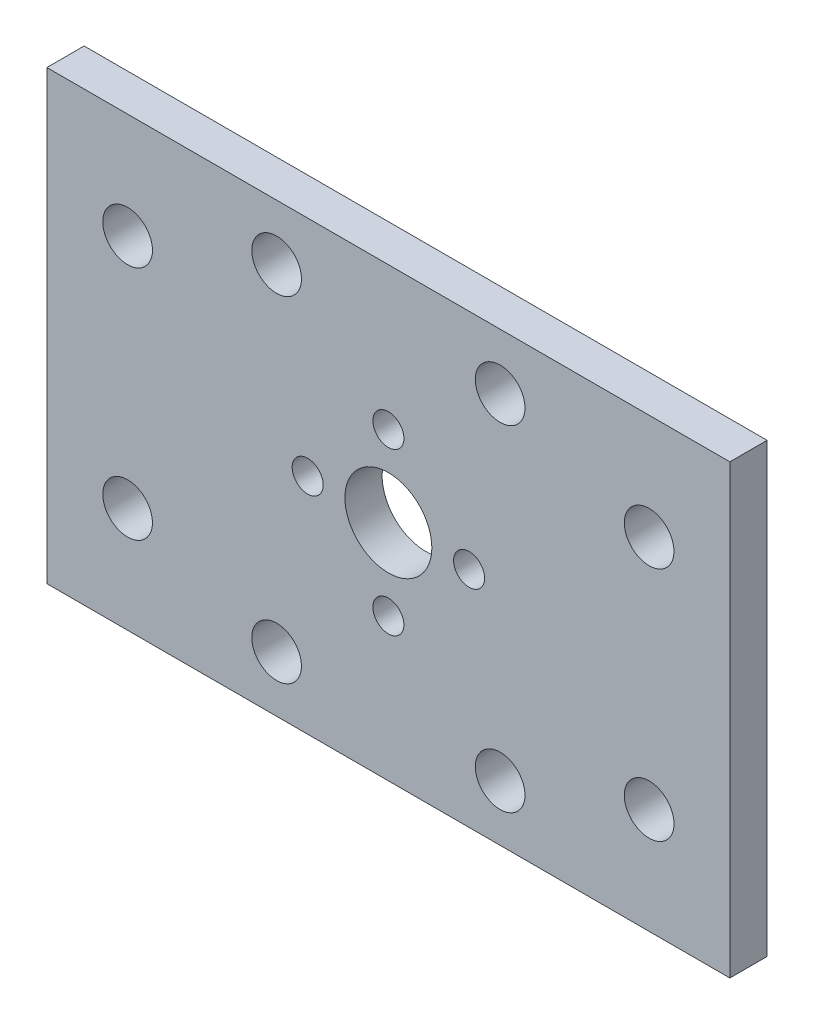
ISO-10303-21;
HEADER;
FILE_DESCRIPTION(('STEP AP214'),'2;1');
FILE_NAME('part.step','',(''),(''),'','','');
FILE_SCHEMA(('AUTOMOTIVE_DESIGN { 1 0 10303 214 1 1 1 1 }'));
ENDSEC;
DATA;
#1=APPLICATION_CONTEXT('core data for automotive mechanical design processes');
#2=APPLICATION_PROTOCOL_DEFINITION('international standard','automotive_design',2000,#1);
#3=PRODUCT_CONTEXT('',#1,'mechanical');
#4=PRODUCT('Part','Part','',(#3));
#5=PRODUCT_RELATED_PRODUCT_CATEGORY('part','',(#4));
#6=PRODUCT_DEFINITION_FORMATION('','',#4);
#7=PRODUCT_DEFINITION_CONTEXT('part definition',#1,'design');
#8=PRODUCT_DEFINITION('design','',#6,#7);
#9=PRODUCT_DEFINITION_SHAPE('','',#8);
#10=(LENGTH_UNIT() NAMED_UNIT(*) SI_UNIT(.MILLI.,.METRE.));
#11=(NAMED_UNIT(*) PLANE_ANGLE_UNIT() SI_UNIT($,.RADIAN.));
#12=(NAMED_UNIT(*) SI_UNIT($,.STERADIAN.) SOLID_ANGLE_UNIT());
#13=UNCERTAINTY_MEASURE_WITH_UNIT(LENGTH_MEASURE(1.E-05),#10,'distance_accuracy_value','');
#14=(GEOMETRIC_REPRESENTATION_CONTEXT(3) GLOBAL_UNCERTAINTY_ASSIGNED_CONTEXT((#13)) GLOBAL_UNIT_ASSIGNED_CONTEXT((#10,
#11,#12)) REPRESENTATION_CONTEXT('',''));
#15=CARTESIAN_POINT('',(0.,0.,0.));
#16=DIRECTION('',(0.,0.,1.));
#17=DIRECTION('',(1.,0.,0.));
#18=AXIS2_PLACEMENT_3D('',#15,#16,#17);
#19=CARTESIAN_POINT('',(0.,0.,1.5));
#20=DIRECTION('',(0.,0.,1.));
#21=DIRECTION('',(1.,0.,0.));
#22=AXIS2_PLACEMENT_3D('',#19,#20,#21);
#23=PLANE('',#22);
#24=CARTESIAN_POINT('',(9.,13.5,1.5));
#25=DIRECTION('',(0.,0.,1.));
#26=DIRECTION('',(-1.,0.,0.));
#27=AXIS2_PLACEMENT_3D('',#24,#25,#26);
#28=CIRCLE('',#27,2.);
#29=CARTESIAN_POINT('',(7.,13.5,1.5));
#30=VERTEX_POINT('',#29);
#31=EDGE_CURVE('E175',#30,#30,#28,.T.);
#32=ORIENTED_EDGE('',*,*,#31,.F.);
#33=EDGE_LOOP('',(#32));
#34=FACE_BOUND('',#33,.T.);
#35=CARTESIAN_POINT('',(9.,-13.5,1.5));
#36=DIRECTION('',(0.,0.,1.));
#37=DIRECTION('',(1.,0.,0.));
#38=AXIS2_PLACEMENT_3D('',#35,#36,#37);
#39=CIRCLE('',#38,2.);
#40=CARTESIAN_POINT('',(11.,-13.5,1.5));
#41=VERTEX_POINT('',#40);
#42=EDGE_CURVE('E163',#41,#41,#39,.T.);
#43=ORIENTED_EDGE('',*,*,#42,.F.);
#44=EDGE_LOOP('',(#43));
#45=FACE_BOUND('',#44,.T.);
#46=CARTESIAN_POINT('',(0.,-6.5,1.5));
#47=DIRECTION('',(0.,0.,1.));
#48=DIRECTION('',(1.,0.,0.));
#49=AXIS2_PLACEMENT_3D('',#46,#47,#48);
#50=CIRCLE('',#49,1.25);
#51=CARTESIAN_POINT('',(1.25,-6.5,1.5));
#52=VERTEX_POINT('',#51);
#53=EDGE_CURVE('E151',#52,#52,#50,.T.);
#54=ORIENTED_EDGE('',*,*,#53,.F.);
#55=EDGE_LOOP('',(#54));
#56=FACE_BOUND('',#55,.T.);
#57=CARTESIAN_POINT('',(0.,6.5,1.5));
#58=DIRECTION('',(0.,0.,1.));
#59=DIRECTION('',(1.,0.,0.));
#60=AXIS2_PLACEMENT_3D('',#57,#58,#59);
#61=CIRCLE('',#60,1.25);
#62=CARTESIAN_POINT('',(1.25,6.5,1.5));
#63=VERTEX_POINT('',#62);
#64=EDGE_CURVE('E139',#63,#63,#61,.T.);
#65=ORIENTED_EDGE('',*,*,#64,.F.);
#66=EDGE_LOOP('',(#65));
#67=FACE_BOUND('',#66,.T.);
#68=CARTESIAN_POINT('',(-21.,-9.5,1.5));
#69=DIRECTION('',(0.,0.,1.));
#70=DIRECTION('',(-1.,0.,0.));
#71=AXIS2_PLACEMENT_3D('',#68,#69,#70);
#72=CIRCLE('',#71,2.);
#73=CARTESIAN_POINT('',(-23.,-9.5,1.5));
#74=VERTEX_POINT('',#73);
#75=EDGE_CURVE('E127',#74,#74,#72,.T.);
#76=ORIENTED_EDGE('',*,*,#75,.F.);
#77=EDGE_LOOP('',(#76));
#78=FACE_BOUND('',#77,.T.);
#79=CARTESIAN_POINT('',(-21.,9.5,1.5));
#80=DIRECTION('',(0.,0.,1.));
#81=DIRECTION('',(1.,0.,0.));
#82=AXIS2_PLACEMENT_3D('',#79,#80,#81);
#83=CIRCLE('',#82,2.);
#84=CARTESIAN_POINT('',(-19.,9.5,1.5));
#85=VERTEX_POINT('',#84);
#86=EDGE_CURVE('E115',#85,#85,#83,.T.);
#87=ORIENTED_EDGE('',*,*,#86,.F.);
#88=EDGE_LOOP('',(#87));
#89=FACE_BOUND('',#88,.T.);
#90=DIRECTION('',(0.,1.,0.));
#91=VECTOR('',#90,1.);
#92=CARTESIAN_POINT('',(27.5,18.,1.5));
#93=LINE('',#92,#91);
#94=CARTESIAN_POINT('',(27.5,-18.,1.5));
#95=VERTEX_POINT('',#94);
#96=CARTESIAN_POINT('',(27.5,18.,1.5));
#97=VERTEX_POINT('',#96);
#98=EDGE_CURVE('E85',#95,#97,#93,.T.);
#99=ORIENTED_EDGE('',*,*,#98,.T.);
#100=DIRECTION('',(-1.,0.,0.));
#101=VECTOR('',#100,1.);
#102=CARTESIAN_POINT('',(-27.5,18.,1.5));
#103=LINE('',#102,#101);
#104=CARTESIAN_POINT('',(-27.5,18.,1.5));
#105=VERTEX_POINT('',#104);
#106=EDGE_CURVE('E80',#97,#105,#103,.T.);
#107=ORIENTED_EDGE('',*,*,#106,.T.);
#108=DIRECTION('',(0.,-1.,0.));
#109=VECTOR('',#108,1.);
#110=CARTESIAN_POINT('',(-27.5,18.,1.5));
#111=LINE('',#110,#109);
#112=CARTESIAN_POINT('',(-27.5,-18.,1.5));
#113=VERTEX_POINT('',#112);
#114=EDGE_CURVE('E83',#105,#113,#111,.T.);
#115=ORIENTED_EDGE('',*,*,#114,.T.);
#116=DIRECTION('',(1.,0.,0.));
#117=VECTOR('',#116,1.);
#118=CARTESIAN_POINT('',(-27.5,-18.,1.5));
#119=LINE('',#118,#117);
#120=EDGE_CURVE('E50',#113,#95,#119,.T.);
#121=ORIENTED_EDGE('',*,*,#120,.T.);
#122=EDGE_LOOP('',(#99,#107,#115,#121));
#123=FACE_BOUND('',#122,.T.);
#124=CARTESIAN_POINT('',(-9.,13.5,1.5));
#125=DIRECTION('',(0.,0.,1.));
#126=DIRECTION('',(1.,0.,0.));
#127=AXIS2_PLACEMENT_3D('',#124,#125,#126);
#128=CIRCLE('',#127,2.);
#129=CARTESIAN_POINT('',(-7.,13.5,1.5));
#130=VERTEX_POINT('',#129);
#131=EDGE_CURVE('E100',#130,#130,#128,.T.);
#132=ORIENTED_EDGE('',*,*,#131,.F.);
#133=EDGE_LOOP('',(#132));
#134=FACE_BOUND('',#133,.T.);
#135=CARTESIAN_POINT('',(-9.,-13.5,1.5));
#136=DIRECTION('',(0.,0.,1.));
#137=DIRECTION('',(-1.,0.,0.));
#138=AXIS2_PLACEMENT_3D('',#135,#136,#137);
#139=CIRCLE('',#138,2.);
#140=CARTESIAN_POINT('',(-11.,-13.5,1.5));
#141=VERTEX_POINT('',#140);
#142=EDGE_CURVE('E121',#141,#141,#139,.T.);
#143=ORIENTED_EDGE('',*,*,#142,.F.);
#144=EDGE_LOOP('',(#143));
#145=FACE_BOUND('',#144,.T.);
#146=CARTESIAN_POINT('',(0.,0.,1.5));
#147=DIRECTION('',(0.,0.,1.));
#148=DIRECTION('',(1.,0.,0.));
#149=AXIS2_PLACEMENT_3D('',#146,#147,#148);
#150=CIRCLE('',#149,3.5);
#151=CARTESIAN_POINT('',(3.5,0.,1.5));
#152=VERTEX_POINT('',#151);
#153=EDGE_CURVE('E133',#152,#152,#150,.T.);
#154=ORIENTED_EDGE('',*,*,#153,.F.);
#155=EDGE_LOOP('',(#154));
#156=FACE_BOUND('',#155,.T.);
#157=CARTESIAN_POINT('',(6.5,0.,1.5));
#158=DIRECTION('',(0.,0.,1.));
#159=DIRECTION('',(1.,0.,0.));
#160=AXIS2_PLACEMENT_3D('',#157,#158,#159);
#161=CIRCLE('',#160,1.25);
#162=CARTESIAN_POINT('',(7.75,0.,1.5));
#163=VERTEX_POINT('',#162);
#164=EDGE_CURVE('E145',#163,#163,#161,.T.);
#165=ORIENTED_EDGE('',*,*,#164,.F.);
#166=EDGE_LOOP('',(#165));
#167=FACE_BOUND('',#166,.T.);
#168=CARTESIAN_POINT('',(-6.5,0.,1.5));
#169=DIRECTION('',(0.,0.,1.));
#170=DIRECTION('',(1.,0.,0.));
#171=AXIS2_PLACEMENT_3D('',#168,#169,#170);
#172=CIRCLE('',#171,1.25);
#173=CARTESIAN_POINT('',(-5.25,0.,1.5));
#174=VERTEX_POINT('',#173);
#175=EDGE_CURVE('E157',#174,#174,#172,.T.);
#176=ORIENTED_EDGE('',*,*,#175,.F.);
#177=EDGE_LOOP('',(#176));
#178=FACE_BOUND('',#177,.T.);
#179=CARTESIAN_POINT('',(21.,-9.5,1.5));
#180=DIRECTION('',(0.,0.,1.));
#181=DIRECTION('',(1.,0.,0.));
#182=AXIS2_PLACEMENT_3D('',#179,#180,#181);
#183=CIRCLE('',#182,2.);
#184=CARTESIAN_POINT('',(23.,-9.5,1.5));
#185=VERTEX_POINT('',#184);
#186=EDGE_CURVE('E169',#185,#185,#183,.T.);
#187=ORIENTED_EDGE('',*,*,#186,.F.);
#188=EDGE_LOOP('',(#187));
#189=FACE_BOUND('',#188,.T.);
#190=CARTESIAN_POINT('',(21.,9.5,1.5));
#191=DIRECTION('',(0.,0.,1.));
#192=DIRECTION('',(-1.,0.,0.));
#193=AXIS2_PLACEMENT_3D('',#190,#191,#192);
#194=CIRCLE('',#193,2.);
#195=CARTESIAN_POINT('',(19.,9.5,1.5));
#196=VERTEX_POINT('',#195);
#197=EDGE_CURVE('E181',#196,#196,#194,.T.);
#198=ORIENTED_EDGE('',*,*,#197,.F.);
#199=EDGE_LOOP('',(#198));
#200=FACE_BOUND('',#199,.T.);
#201=ADVANCED_FACE('F33',(#34,#45,#56,#67,#78,#89,#123,#134,#145,#156,#167,#178,#189,#200),#23,.T.);
#202=CARTESIAN_POINT('',(0.,0.,-1.5));
#203=DIRECTION('',(0.,0.,1.));
#204=DIRECTION('',(1.,0.,0.));
#205=AXIS2_PLACEMENT_3D('',#202,#203,#204);
#206=PLANE('',#205);
#207=DIRECTION('',(0.,1.,0.));
#208=VECTOR('',#207,1.);
#209=CARTESIAN_POINT('',(27.5,18.,-1.5));
#210=LINE('',#209,#208);
#211=CARTESIAN_POINT('',(27.5,-18.,-1.5));
#212=VERTEX_POINT('',#211);
#213=CARTESIAN_POINT('',(27.5,18.,-1.5));
#214=VERTEX_POINT('',#213);
#215=EDGE_CURVE('E97',#212,#214,#210,.T.);
#216=ORIENTED_EDGE('',*,*,#215,.F.);
#217=DIRECTION('',(1.,0.,0.));
#218=VECTOR('',#217,1.);
#219=CARTESIAN_POINT('',(-27.5,-18.,-1.5));
#220=LINE('',#219,#218);
#221=CARTESIAN_POINT('',(-27.5,-18.,-1.5));
#222=VERTEX_POINT('',#221);
#223=EDGE_CURVE('E73',#222,#212,#220,.T.);
#224=ORIENTED_EDGE('',*,*,#223,.F.);
#225=DIRECTION('',(0.,-1.,0.));
#226=VECTOR('',#225,1.);
#227=CARTESIAN_POINT('',(-27.5,18.,-1.5));
#228=LINE('',#227,#226);
#229=CARTESIAN_POINT('',(-27.5,18.,-1.5));
#230=VERTEX_POINT('',#229);
#231=EDGE_CURVE('E67',#230,#222,#228,.T.);
#232=ORIENTED_EDGE('',*,*,#231,.F.);
#233=DIRECTION('',(-1.,0.,0.));
#234=VECTOR('',#233,1.);
#235=CARTESIAN_POINT('',(-27.5,18.,-1.5));
#236=LINE('',#235,#234);
#237=EDGE_CURVE('E89',#214,#230,#236,.T.);
#238=ORIENTED_EDGE('',*,*,#237,.F.);
#239=EDGE_LOOP('',(#216,#224,#232,#238));
#240=FACE_BOUND('',#239,.T.);
#241=CARTESIAN_POINT('',(-9.,13.5,-1.5));
#242=DIRECTION('',(0.,0.,1.));
#243=DIRECTION('',(1.,0.,0.));
#244=AXIS2_PLACEMENT_3D('',#241,#242,#243);
#245=CIRCLE('',#244,2.);
#246=CARTESIAN_POINT('',(-7.,13.5,-1.5));
#247=VERTEX_POINT('',#246);
#248=EDGE_CURVE('E112',#247,#247,#245,.T.);
#249=ORIENTED_EDGE('',*,*,#248,.T.);
#250=EDGE_LOOP('',(#249));
#251=FACE_BOUND('',#250,.T.);
#252=CARTESIAN_POINT('',(-21.,9.5,-1.5));
#253=DIRECTION('',(0.,0.,1.));
#254=DIRECTION('',(1.,0.,0.));
#255=AXIS2_PLACEMENT_3D('',#252,#253,#254);
#256=CIRCLE('',#255,2.);
#257=CARTESIAN_POINT('',(-19.,9.5,-1.5));
#258=VERTEX_POINT('',#257);
#259=EDGE_CURVE('E118',#258,#258,#256,.T.);
#260=ORIENTED_EDGE('',*,*,#259,.T.);
#261=EDGE_LOOP('',(#260));
#262=FACE_BOUND('',#261,.T.);
#263=CARTESIAN_POINT('',(-9.,-13.5,-1.5));
#264=DIRECTION('',(0.,0.,1.));
#265=DIRECTION('',(-1.,0.,0.));
#266=AXIS2_PLACEMENT_3D('',#263,#264,#265);
#267=CIRCLE('',#266,2.);
#268=CARTESIAN_POINT('',(-11.,-13.5,-1.5));
#269=VERTEX_POINT('',#268);
#270=EDGE_CURVE('E124',#269,#269,#267,.T.);
#271=ORIENTED_EDGE('',*,*,#270,.T.);
#272=EDGE_LOOP('',(#271));
#273=FACE_BOUND('',#272,.T.);
#274=CARTESIAN_POINT('',(-21.,-9.5,-1.5));
#275=DIRECTION('',(0.,0.,1.));
#276=DIRECTION('',(-1.,0.,0.));
#277=AXIS2_PLACEMENT_3D('',#274,#275,#276);
#278=CIRCLE('',#277,2.);
#279=CARTESIAN_POINT('',(-23.,-9.5,-1.5));
#280=VERTEX_POINT('',#279);
#281=EDGE_CURVE('E130',#280,#280,#278,.T.);
#282=ORIENTED_EDGE('',*,*,#281,.T.);
#283=EDGE_LOOP('',(#282));
#284=FACE_BOUND('',#283,.T.);
#285=CARTESIAN_POINT('',(0.,0.,-1.5));
#286=DIRECTION('',(0.,0.,1.));
#287=DIRECTION('',(1.,0.,0.));
#288=AXIS2_PLACEMENT_3D('',#285,#286,#287);
#289=CIRCLE('',#288,3.5);
#290=CARTESIAN_POINT('',(3.5,0.,-1.5));
#291=VERTEX_POINT('',#290);
#292=EDGE_CURVE('E136',#291,#291,#289,.T.);
#293=ORIENTED_EDGE('',*,*,#292,.T.);
#294=EDGE_LOOP('',(#293));
#295=FACE_BOUND('',#294,.T.);
#296=CARTESIAN_POINT('',(0.,6.5,-1.5));
#297=DIRECTION('',(0.,0.,1.));
#298=DIRECTION('',(1.,0.,0.));
#299=AXIS2_PLACEMENT_3D('',#296,#297,#298);
#300=CIRCLE('',#299,1.25);
#301=CARTESIAN_POINT('',(1.25,6.5,-1.5));
#302=VERTEX_POINT('',#301);
#303=EDGE_CURVE('E142',#302,#302,#300,.T.);
#304=ORIENTED_EDGE('',*,*,#303,.T.);
#305=EDGE_LOOP('',(#304));
#306=FACE_BOUND('',#305,.T.);
#307=CARTESIAN_POINT('',(6.5,0.,-1.5));
#308=DIRECTION('',(0.,0.,1.));
#309=DIRECTION('',(1.,0.,0.));
#310=AXIS2_PLACEMENT_3D('',#307,#308,#309);
#311=CIRCLE('',#310,1.25);
#312=CARTESIAN_POINT('',(7.75,0.,-1.5));
#313=VERTEX_POINT('',#312);
#314=EDGE_CURVE('E148',#313,#313,#311,.T.);
#315=ORIENTED_EDGE('',*,*,#314,.T.);
#316=EDGE_LOOP('',(#315));
#317=FACE_BOUND('',#316,.T.);
#318=CARTESIAN_POINT('',(0.,-6.5,-1.5));
#319=DIRECTION('',(0.,0.,1.));
#320=DIRECTION('',(1.,0.,0.));
#321=AXIS2_PLACEMENT_3D('',#318,#319,#320);
#322=CIRCLE('',#321,1.25);
#323=CARTESIAN_POINT('',(1.25,-6.5,-1.5));
#324=VERTEX_POINT('',#323);
#325=EDGE_CURVE('E154',#324,#324,#322,.T.);
#326=ORIENTED_EDGE('',*,*,#325,.T.);
#327=EDGE_LOOP('',(#326));
#328=FACE_BOUND('',#327,.T.);
#329=CARTESIAN_POINT('',(-6.5,0.,-1.5));
#330=DIRECTION('',(0.,0.,1.));
#331=DIRECTION('',(1.,0.,0.));
#332=AXIS2_PLACEMENT_3D('',#329,#330,#331);
#333=CIRCLE('',#332,1.25);
#334=CARTESIAN_POINT('',(-5.25,0.,-1.5));
#335=VERTEX_POINT('',#334);
#336=EDGE_CURVE('E160',#335,#335,#333,.T.);
#337=ORIENTED_EDGE('',*,*,#336,.T.);
#338=EDGE_LOOP('',(#337));
#339=FACE_BOUND('',#338,.T.);
#340=CARTESIAN_POINT('',(9.,-13.5,-1.5));
#341=DIRECTION('',(0.,0.,1.));
#342=DIRECTION('',(1.,0.,0.));
#343=AXIS2_PLACEMENT_3D('',#340,#341,#342);
#344=CIRCLE('',#343,2.);
#345=CARTESIAN_POINT('',(11.,-13.5,-1.5));
#346=VERTEX_POINT('',#345);
#347=EDGE_CURVE('E166',#346,#346,#344,.T.);
#348=ORIENTED_EDGE('',*,*,#347,.T.);
#349=EDGE_LOOP('',(#348));
#350=FACE_BOUND('',#349,.T.);
#351=CARTESIAN_POINT('',(21.,-9.5,-1.5));
#352=DIRECTION('',(0.,0.,1.));
#353=DIRECTION('',(1.,0.,0.));
#354=AXIS2_PLACEMENT_3D('',#351,#352,#353);
#355=CIRCLE('',#354,2.);
#356=CARTESIAN_POINT('',(23.,-9.5,-1.5));
#357=VERTEX_POINT('',#356);
#358=EDGE_CURVE('E172',#357,#357,#355,.T.);
#359=ORIENTED_EDGE('',*,*,#358,.T.);
#360=EDGE_LOOP('',(#359));
#361=FACE_BOUND('',#360,.T.);
#362=CARTESIAN_POINT('',(9.,13.5,-1.5));
#363=DIRECTION('',(0.,0.,1.));
#364=DIRECTION('',(-1.,0.,0.));
#365=AXIS2_PLACEMENT_3D('',#362,#363,#364);
#366=CIRCLE('',#365,2.);
#367=CARTESIAN_POINT('',(7.,13.5,-1.5));
#368=VERTEX_POINT('',#367);
#369=EDGE_CURVE('E178',#368,#368,#366,.T.);
#370=ORIENTED_EDGE('',*,*,#369,.T.);
#371=EDGE_LOOP('',(#370));
#372=FACE_BOUND('',#371,.T.);
#373=CARTESIAN_POINT('',(21.,9.5,-1.5));
#374=DIRECTION('',(0.,0.,1.));
#375=DIRECTION('',(-1.,0.,0.));
#376=AXIS2_PLACEMENT_3D('',#373,#374,#375);
#377=CIRCLE('',#376,2.);
#378=CARTESIAN_POINT('',(19.,9.5,-1.5));
#379=VERTEX_POINT('',#378);
#380=EDGE_CURVE('E184',#379,#379,#377,.T.);
#381=ORIENTED_EDGE('',*,*,#380,.T.);
#382=EDGE_LOOP('',(#381));
#383=FACE_BOUND('',#382,.T.);
#384=ADVANCED_FACE('F108',(#240,#251,#262,#273,#284,#295,#306,#317,#328,#339,#350,#361,#372,
#383),#206,.F.);
#385=CARTESIAN_POINT('',(27.5,18.,1.5));
#386=DIRECTION('',(-1.,0.,0.));
#387=DIRECTION('',(0.,-1.,0.));
#388=AXIS2_PLACEMENT_3D('',#385,#386,#387);
#389=PLANE('',#388);
#390=ORIENTED_EDGE('',*,*,#215,.T.);
#391=DIRECTION('',(0.,0.,-1.));
#392=VECTOR('',#391,1.);
#393=CARTESIAN_POINT('',(27.5,18.,1.5));
#394=LINE('',#393,#392);
#395=EDGE_CURVE('E11',#97,#214,#394,.T.);
#396=ORIENTED_EDGE('',*,*,#395,.F.);
#397=ORIENTED_EDGE('',*,*,#98,.F.);
#398=DIRECTION('',(0.,0.,-1.));
#399=VECTOR('',#398,1.);
#400=CARTESIAN_POINT('',(27.5,-18.,1.5));
#401=LINE('',#400,#399);
#402=EDGE_CURVE('E93',#95,#212,#401,.T.);
#403=ORIENTED_EDGE('',*,*,#402,.T.);
#404=EDGE_LOOP('',(#390,#396,#397,#403));
#405=FACE_BOUND('',#404,.T.);
#406=ADVANCED_FACE('F35',(#405),#389,.F.);
#407=CARTESIAN_POINT('',(-27.5,18.,1.5));
#408=DIRECTION('',(0.,-1.,0.));
#409=DIRECTION('',(0.,0.,-1.));
#410=AXIS2_PLACEMENT_3D('',#407,#408,#409);
#411=PLANE('',#410);
#412=ORIENTED_EDGE('',*,*,#237,.T.);
#413=DIRECTION('',(0.,0.,-1.));
#414=VECTOR('',#413,1.);
#415=CARTESIAN_POINT('',(-27.5,18.,1.5));
#416=LINE('',#415,#414);
#417=EDGE_CURVE('E42',#105,#230,#416,.T.);
#418=ORIENTED_EDGE('',*,*,#417,.F.);
#419=ORIENTED_EDGE('',*,*,#106,.F.);
#420=ORIENTED_EDGE('',*,*,#395,.T.);
#421=EDGE_LOOP('',(#412,#418,#419,#420));
#422=FACE_BOUND('',#421,.T.);
#423=ADVANCED_FACE('F88',(#422),#411,.F.);
#424=CARTESIAN_POINT('',(-27.5,18.,1.5));
#425=DIRECTION('',(1.,0.,0.));
#426=DIRECTION('',(0.,1.,0.));
#427=AXIS2_PLACEMENT_3D('',#424,#425,#426);
#428=PLANE('',#427);
#429=ORIENTED_EDGE('',*,*,#231,.T.);
#430=DIRECTION('',(0.,0.,-1.));
#431=VECTOR('',#430,1.);
#432=CARTESIAN_POINT('',(-27.5,-18.,1.5));
#433=LINE('',#432,#431);
#434=EDGE_CURVE('E90',#113,#222,#433,.T.);
#435=ORIENTED_EDGE('',*,*,#434,.F.);
#436=ORIENTED_EDGE('',*,*,#114,.F.);
#437=ORIENTED_EDGE('',*,*,#417,.T.);
#438=EDGE_LOOP('',(#429,#435,#436,#437));
#439=FACE_BOUND('',#438,.T.);
#440=ADVANCED_FACE('F91',(#439),#428,.F.);
#441=CARTESIAN_POINT('',(-27.5,-18.,1.5));
#442=DIRECTION('',(0.,1.,0.));
#443=DIRECTION('',(0.,0.,1.));
#444=AXIS2_PLACEMENT_3D('',#441,#442,#443);
#445=PLANE('',#444);
#446=ORIENTED_EDGE('',*,*,#223,.T.);
#447=ORIENTED_EDGE('',*,*,#402,.F.);
#448=ORIENTED_EDGE('',*,*,#120,.F.);
#449=ORIENTED_EDGE('',*,*,#434,.T.);
#450=EDGE_LOOP('',(#446,#447,#448,#449));
#451=FACE_BOUND('',#450,.T.);
#452=ADVANCED_FACE('F105',(#451),#445,.F.);
#453=CARTESIAN_POINT('',(-9.,13.5,1.5));
#454=DIRECTION('',(0.,0.,-1.));
#455=DIRECTION('',(-1.,0.,0.));
#456=AXIS2_PLACEMENT_3D('',#453,#454,#455);
#457=CYLINDRICAL_SURFACE('',#456,2.);
#458=ORIENTED_EDGE('',*,*,#131,.T.);
#459=EDGE_LOOP('',(#458));
#460=FACE_BOUND('',#459,.T.);
#461=ORIENTED_EDGE('',*,*,#248,.F.);
#462=EDGE_LOOP('',(#461));
#463=FACE_BOUND('',#462,.T.);
#464=ADVANCED_FACE('F203',(#460,#463),#457,.F.);
#465=CARTESIAN_POINT('',(-21.,9.5,1.5));
#466=DIRECTION('',(0.,0.,-1.));
#467=DIRECTION('',(-1.,0.,0.));
#468=AXIS2_PLACEMENT_3D('',#465,#466,#467);
#469=CYLINDRICAL_SURFACE('',#468,2.);
#470=ORIENTED_EDGE('',*,*,#86,.T.);
#471=EDGE_LOOP('',(#470));
#472=FACE_BOUND('',#471,.T.);
#473=ORIENTED_EDGE('',*,*,#259,.F.);
#474=EDGE_LOOP('',(#473));
#475=FACE_BOUND('',#474,.T.);
#476=ADVANCED_FACE('F249',(#472,#475),#469,.F.);
#477=CARTESIAN_POINT('',(-9.,-13.5,1.5));
#478=DIRECTION('',(0.,0.,-1.));
#479=DIRECTION('',(-1.,0.,0.));
#480=AXIS2_PLACEMENT_3D('',#477,#478,#479);
#481=CYLINDRICAL_SURFACE('',#480,2.);
#482=ORIENTED_EDGE('',*,*,#142,.T.);
#483=EDGE_LOOP('',(#482));
#484=FACE_BOUND('',#483,.T.);
#485=ORIENTED_EDGE('',*,*,#270,.F.);
#486=EDGE_LOOP('',(#485));
#487=FACE_BOUND('',#486,.T.);
#488=ADVANCED_FACE('F257',(#484,#487),#481,.F.);
#489=CARTESIAN_POINT('',(-21.,-9.5,1.5));
#490=DIRECTION('',(0.,0.,-1.));
#491=DIRECTION('',(-1.,0.,0.));
#492=AXIS2_PLACEMENT_3D('',#489,#490,#491);
#493=CYLINDRICAL_SURFACE('',#492,2.);
#494=ORIENTED_EDGE('',*,*,#75,.T.);
#495=EDGE_LOOP('',(#494));
#496=FACE_BOUND('',#495,.T.);
#497=ORIENTED_EDGE('',*,*,#281,.F.);
#498=EDGE_LOOP('',(#497));
#499=FACE_BOUND('',#498,.T.);
#500=ADVANCED_FACE('F265',(#496,#499),#493,.F.);
#501=CARTESIAN_POINT('',(0.,0.,1.5));
#502=DIRECTION('',(0.,0.,-1.));
#503=DIRECTION('',(-1.,0.,0.));
#504=AXIS2_PLACEMENT_3D('',#501,#502,#503);
#505=CYLINDRICAL_SURFACE('',#504,3.5);
#506=ORIENTED_EDGE('',*,*,#153,.T.);
#507=EDGE_LOOP('',(#506));
#508=FACE_BOUND('',#507,.T.);
#509=ORIENTED_EDGE('',*,*,#292,.F.);
#510=EDGE_LOOP('',(#509));
#511=FACE_BOUND('',#510,.T.);
#512=ADVANCED_FACE('F274',(#508,#511),#505,.F.);
#513=CARTESIAN_POINT('',(0.,6.5,1.5));
#514=DIRECTION('',(0.,0.,-1.));
#515=DIRECTION('',(-1.,0.,0.));
#516=AXIS2_PLACEMENT_3D('',#513,#514,#515);
#517=CYLINDRICAL_SURFACE('',#516,1.25);
#518=ORIENTED_EDGE('',*,*,#64,.T.);
#519=EDGE_LOOP('',(#518));
#520=FACE_BOUND('',#519,.T.);
#521=ORIENTED_EDGE('',*,*,#303,.F.);
#522=EDGE_LOOP('',(#521));
#523=FACE_BOUND('',#522,.T.);
#524=ADVANCED_FACE('F283',(#520,#523),#517,.F.);
#525=CARTESIAN_POINT('',(6.5,0.,1.5));
#526=DIRECTION('',(0.,0.,-1.));
#527=DIRECTION('',(-1.,0.,0.));
#528=AXIS2_PLACEMENT_3D('',#525,#526,#527);
#529=CYLINDRICAL_SURFACE('',#528,1.25);
#530=ORIENTED_EDGE('',*,*,#164,.T.);
#531=EDGE_LOOP('',(#530));
#532=FACE_BOUND('',#531,.T.);
#533=ORIENTED_EDGE('',*,*,#314,.F.);
#534=EDGE_LOOP('',(#533));
#535=FACE_BOUND('',#534,.T.);
#536=ADVANCED_FACE('F292',(#532,#535),#529,.F.);
#537=CARTESIAN_POINT('',(0.,-6.5,1.5));
#538=DIRECTION('',(0.,0.,-1.));
#539=DIRECTION('',(-1.,0.,0.));
#540=AXIS2_PLACEMENT_3D('',#537,#538,#539);
#541=CYLINDRICAL_SURFACE('',#540,1.25);
#542=ORIENTED_EDGE('',*,*,#53,.T.);
#543=EDGE_LOOP('',(#542));
#544=FACE_BOUND('',#543,.T.);
#545=ORIENTED_EDGE('',*,*,#325,.F.);
#546=EDGE_LOOP('',(#545));
#547=FACE_BOUND('',#546,.T.);
#548=ADVANCED_FACE('F301',(#544,#547),#541,.F.);
#549=CARTESIAN_POINT('',(-6.5,0.,1.5));
#550=DIRECTION('',(0.,0.,-1.));
#551=DIRECTION('',(-1.,0.,0.));
#552=AXIS2_PLACEMENT_3D('',#549,#550,#551);
#553=CYLINDRICAL_SURFACE('',#552,1.25);
#554=ORIENTED_EDGE('',*,*,#175,.T.);
#555=EDGE_LOOP('',(#554));
#556=FACE_BOUND('',#555,.T.);
#557=ORIENTED_EDGE('',*,*,#336,.F.);
#558=EDGE_LOOP('',(#557));
#559=FACE_BOUND('',#558,.T.);
#560=ADVANCED_FACE('F310',(#556,#559),#553,.F.);
#561=CARTESIAN_POINT('',(9.,-13.5,1.5));
#562=DIRECTION('',(0.,0.,-1.));
#563=DIRECTION('',(-1.,0.,0.));
#564=AXIS2_PLACEMENT_3D('',#561,#562,#563);
#565=CYLINDRICAL_SURFACE('',#564,2.);
#566=ORIENTED_EDGE('',*,*,#42,.T.);
#567=EDGE_LOOP('',(#566));
#568=FACE_BOUND('',#567,.T.);
#569=ORIENTED_EDGE('',*,*,#347,.F.);
#570=EDGE_LOOP('',(#569));
#571=FACE_BOUND('',#570,.T.);
#572=ADVANCED_FACE('F319',(#568,#571),#565,.F.);
#573=CARTESIAN_POINT('',(21.,-9.5,1.5));
#574=DIRECTION('',(0.,0.,-1.));
#575=DIRECTION('',(-1.,0.,0.));
#576=AXIS2_PLACEMENT_3D('',#573,#574,#575);
#577=CYLINDRICAL_SURFACE('',#576,2.);
#578=ORIENTED_EDGE('',*,*,#186,.T.);
#579=EDGE_LOOP('',(#578));
#580=FACE_BOUND('',#579,.T.);
#581=ORIENTED_EDGE('',*,*,#358,.F.);
#582=EDGE_LOOP('',(#581));
#583=FACE_BOUND('',#582,.T.);
#584=ADVANCED_FACE('F328',(#580,#583),#577,.F.);
#585=CARTESIAN_POINT('',(9.,13.5,1.5));
#586=DIRECTION('',(0.,0.,-1.));
#587=DIRECTION('',(-1.,0.,0.));
#588=AXIS2_PLACEMENT_3D('',#585,#586,#587);
#589=CYLINDRICAL_SURFACE('',#588,2.);
#590=ORIENTED_EDGE('',*,*,#31,.T.);
#591=EDGE_LOOP('',(#590));
#592=FACE_BOUND('',#591,.T.);
#593=ORIENTED_EDGE('',*,*,#369,.F.);
#594=EDGE_LOOP('',(#593));
#595=FACE_BOUND('',#594,.T.);
#596=ADVANCED_FACE('F337',(#592,#595),#589,.F.);
#597=CARTESIAN_POINT('',(21.,9.5,1.5));
#598=DIRECTION('',(0.,0.,-1.));
#599=DIRECTION('',(-1.,0.,0.));
#600=AXIS2_PLACEMENT_3D('',#597,#598,#599);
#601=CYLINDRICAL_SURFACE('',#600,2.);
#602=ORIENTED_EDGE('',*,*,#197,.T.);
#603=EDGE_LOOP('',(#602));
#604=FACE_BOUND('',#603,.T.);
#605=ORIENTED_EDGE('',*,*,#380,.F.);
#606=EDGE_LOOP('',(#605));
#607=FACE_BOUND('',#606,.T.);
#608=ADVANCED_FACE('F190',(#604,#607),#601,.F.);
#609=CLOSED_SHELL('',(#201,#384,#406,#423,#440,#452,#464,#476,#488,#500,#512,#524,#536,#548,
#560,#572,#584,#596,#608));
#610=MANIFOLD_SOLID_BREP('B2',#609);
#611=ADVANCED_BREP_SHAPE_REPRESENTATION('',(#18,#610),#14);
#612=SHAPE_DEFINITION_REPRESENTATION(#9,#611);
ENDSEC;
END-ISO-10303-21;
